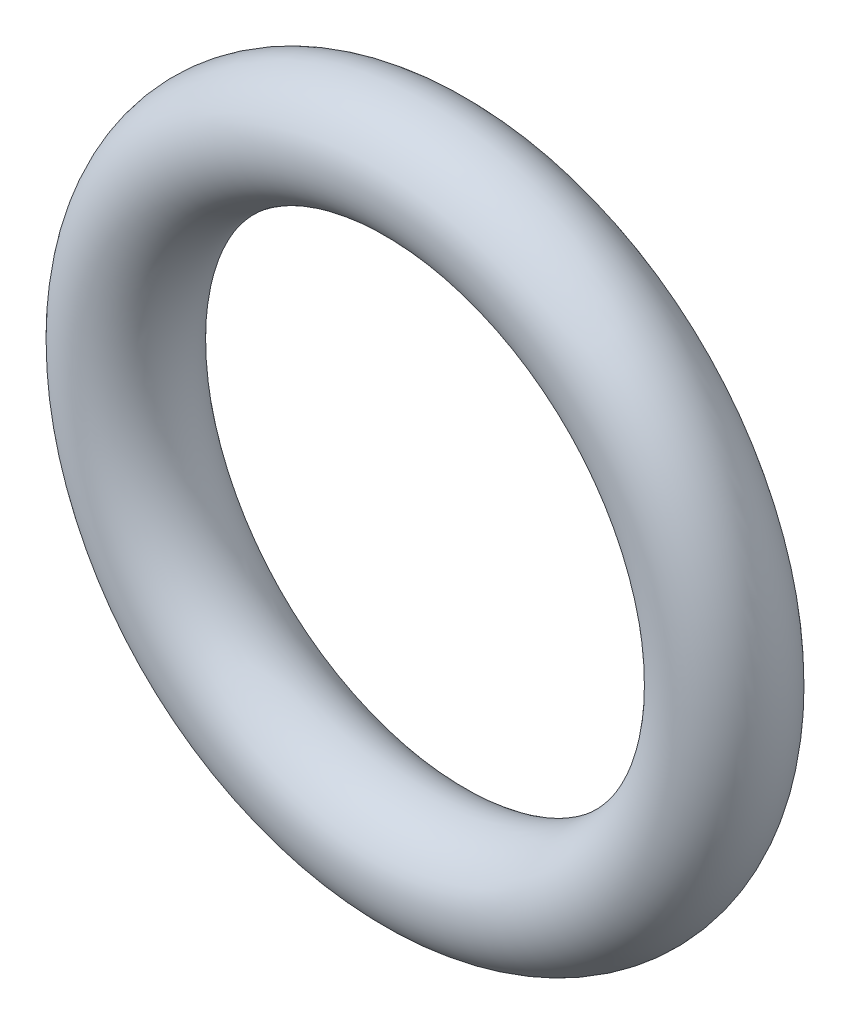
ISO-10303-21;
HEADER;
FILE_DESCRIPTION(('STEP AP214'),'2;1');
FILE_NAME('part.step','',(''),(''),'','','');
FILE_SCHEMA(('AUTOMOTIVE_DESIGN { 1 0 10303 214 1 1 1 1 }'));
ENDSEC;
DATA;
#1=APPLICATION_CONTEXT('core data for automotive mechanical design processes');
#2=APPLICATION_PROTOCOL_DEFINITION('international standard','automotive_design',2000,#1);
#3=PRODUCT_CONTEXT('',#1,'mechanical');
#4=PRODUCT('Part','Part','',(#3));
#5=PRODUCT_RELATED_PRODUCT_CATEGORY('part','',(#4));
#6=PRODUCT_DEFINITION_FORMATION('','',#4);
#7=PRODUCT_DEFINITION_CONTEXT('part definition',#1,'design');
#8=PRODUCT_DEFINITION('design','',#6,#7);
#9=PRODUCT_DEFINITION_SHAPE('','',#8);
#10=(LENGTH_UNIT() NAMED_UNIT(*) SI_UNIT(.MILLI.,.METRE.));
#11=(NAMED_UNIT(*) PLANE_ANGLE_UNIT() SI_UNIT($,.RADIAN.));
#12=(NAMED_UNIT(*) SI_UNIT($,.STERADIAN.) SOLID_ANGLE_UNIT());
#13=UNCERTAINTY_MEASURE_WITH_UNIT(LENGTH_MEASURE(1.E-05),#10,'distance_accuracy_value','');
#14=(GEOMETRIC_REPRESENTATION_CONTEXT(3) GLOBAL_UNCERTAINTY_ASSIGNED_CONTEXT((#13)) GLOBAL_UNIT_ASSIGNED_CONTEXT((#10,
#11,#12)) REPRESENTATION_CONTEXT('',''));
#15=CARTESIAN_POINT('',(0.,0.,0.));
#16=DIRECTION('',(0.,0.,1.));
#17=DIRECTION('',(1.,0.,0.));
#18=AXIS2_PLACEMENT_3D('',#15,#16,#17);
#19=CARTESIAN_POINT('',(0.,0.,0.));
#20=DIRECTION('',(0.,0.,1.));
#21=DIRECTION('',(1.,0.,0.));
#22=AXIS2_PLACEMENT_3D('',#19,#20,#21);
#23=TOROIDAL_SURFACE('',#22,4.7117,0.888999999999998);
#24=CARTESIAN_POINT('',(5.6007,0.,0.));
#25=VERTEX_POINT('',#24);
#26=VERTEX_LOOP('',#25);
#27=FACE_BOUND('',#26,.T.);
#28=ADVANCED_FACE('F28',(#27),#23,.T.);
#29=CLOSED_SHELL('',(#28));
#30=MANIFOLD_SOLID_BREP('B2',#29);
#31=ADVANCED_BREP_SHAPE_REPRESENTATION('',(#18,#30),#14);
#32=SHAPE_DEFINITION_REPRESENTATION(#9,#31);
ENDSEC;
END-ISO-10303-21;
